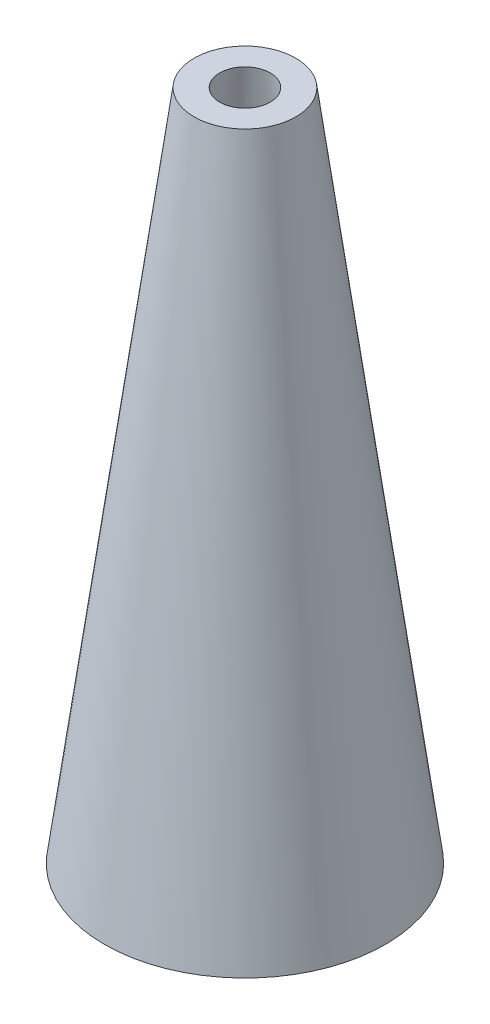
ISO-10303-21;
HEADER;
FILE_DESCRIPTION(('STEP AP214'),'2;1');
FILE_NAME('part.step','',(''),(''),'','','');
FILE_SCHEMA(('AUTOMOTIVE_DESIGN { 1 0 10303 214 1 1 1 1 }'));
ENDSEC;
DATA;
#1=APPLICATION_CONTEXT('core data for automotive mechanical design processes');
#2=APPLICATION_PROTOCOL_DEFINITION('international standard','automotive_design',2000,#1);
#3=PRODUCT_CONTEXT('',#1,'mechanical');
#4=PRODUCT('Part','Part','',(#3));
#5=PRODUCT_RELATED_PRODUCT_CATEGORY('part','',(#4));
#6=PRODUCT_DEFINITION_FORMATION('','',#4);
#7=PRODUCT_DEFINITION_CONTEXT('part definition',#1,'design');
#8=PRODUCT_DEFINITION('design','',#6,#7);
#9=PRODUCT_DEFINITION_SHAPE('','',#8);
#10=(LENGTH_UNIT() NAMED_UNIT(*) SI_UNIT(.MILLI.,.METRE.));
#11=(NAMED_UNIT(*) PLANE_ANGLE_UNIT() SI_UNIT($,.RADIAN.));
#12=(NAMED_UNIT(*) SI_UNIT($,.STERADIAN.) SOLID_ANGLE_UNIT());
#13=UNCERTAINTY_MEASURE_WITH_UNIT(LENGTH_MEASURE(1.E-05),#10,'distance_accuracy_value','');
#14=(GEOMETRIC_REPRESENTATION_CONTEXT(3) GLOBAL_UNCERTAINTY_ASSIGNED_CONTEXT((#13)) GLOBAL_UNIT_ASSIGNED_CONTEXT((#10,
#11,#12)) REPRESENTATION_CONTEXT('',''));
#15=CARTESIAN_POINT('',(0.,0.,0.));
#16=DIRECTION('',(0.,0.,1.));
#17=DIRECTION('',(1.,0.,0.));
#18=AXIS2_PLACEMENT_3D('',#15,#16,#17);
#19=CARTESIAN_POINT('',(0.,0.,0.));
#20=DIRECTION('',(0.,-1.,0.));
#21=DIRECTION('',(0.,0.,1.));
#22=AXIS2_PLACEMENT_3D('',#19,#20,#21);
#23=CONICAL_SURFACE('',#22,5.5,0.132645023151569);
#24=CARTESIAN_POINT('',(0.,26.3,0.));
#25=DIRECTION('',(0.,1.,0.));
#26=DIRECTION('',(0.,0.,1.));
#27=AXIS2_PLACEMENT_3D('',#24,#25,#26);
#28=CIRCLE('',#27,1.99083078047825);
#29=CARTESIAN_POINT('',(0.,26.3,1.99083078047825));
#30=VERTEX_POINT('',#29);
#31=EDGE_CURVE('E10',#30,#30,#28,.T.);
#32=ORIENTED_EDGE('',*,*,#31,.F.);
#33=EDGE_LOOP('',(#32));
#34=FACE_BOUND('',#33,.T.);
#35=CARTESIAN_POINT('',(0.,0.,0.));
#36=DIRECTION('',(0.,1.,0.));
#37=DIRECTION('',(0.,0.,1.));
#38=AXIS2_PLACEMENT_3D('',#35,#36,#37);
#39=CIRCLE('',#38,5.5);
#40=CARTESIAN_POINT('',(0.,0.,5.5));
#41=VERTEX_POINT('',#40);
#42=EDGE_CURVE('E44',#41,#41,#39,.T.);
#43=ORIENTED_EDGE('',*,*,#42,.T.);
#44=EDGE_LOOP('',(#43));
#45=FACE_BOUND('',#44,.T.);
#46=ADVANCED_FACE('F37',(#34,#45),#23,.T.);
#47=CARTESIAN_POINT('',(0.,26.3,0.));
#48=DIRECTION('',(0.,1.,0.));
#49=DIRECTION('',(0.,0.,1.));
#50=AXIS2_PLACEMENT_3D('',#47,#48,#49);
#51=PLANE('',#50);
#52=CARTESIAN_POINT('',(0.,26.3,0.));
#53=DIRECTION('',(0.,-1.,0.));
#54=DIRECTION('',(0.,0.,-1.));
#55=AXIS2_PLACEMENT_3D('',#52,#53,#54);
#56=CIRCLE('',#55,0.990830780478254);
#57=CARTESIAN_POINT('',(0.,26.3,-0.990830780478253));
#58=VERTEX_POINT('',#57);
#59=EDGE_CURVE('E49',#58,#58,#56,.T.);
#60=ORIENTED_EDGE('',*,*,#59,.T.);
#61=EDGE_LOOP('',(#60));
#62=FACE_BOUND('',#61,.T.);
#63=ORIENTED_EDGE('',*,*,#31,.T.);
#64=EDGE_LOOP('',(#63));
#65=FACE_BOUND('',#64,.T.);
#66=ADVANCED_FACE('F66',(#62,#65),#51,.T.);
#67=CARTESIAN_POINT('',(0.,0.,0.));
#68=DIRECTION('',(0.,1.,0.));
#69=DIRECTION('',(0.,0.,1.));
#70=AXIS2_PLACEMENT_3D('',#67,#68,#69);
#71=PLANE('',#70);
#72=CARTESIAN_POINT('',(0.,0.,0.));
#73=DIRECTION('',(0.,-1.,0.));
#74=DIRECTION('',(0.,0.,-1.));
#75=AXIS2_PLACEMENT_3D('',#72,#73,#74);
#76=CIRCLE('',#75,4.5);
#77=CARTESIAN_POINT('',(0.,0.,-4.5));
#78=VERTEX_POINT('',#77);
#79=EDGE_CURVE('E54',#78,#78,#76,.T.);
#80=ORIENTED_EDGE('',*,*,#79,.F.);
#81=EDGE_LOOP('',(#80));
#82=FACE_BOUND('',#81,.T.);
#83=ORIENTED_EDGE('',*,*,#42,.F.);
#84=EDGE_LOOP('',(#83));
#85=FACE_BOUND('',#84,.T.);
#86=ADVANCED_FACE('F63',(#82,#85),#71,.F.);
#87=CARTESIAN_POINT('',(0.,0.,0.));
#88=DIRECTION('',(0.,-1.,0.));
#89=DIRECTION('',(0.,0.,-1.));
#90=AXIS2_PLACEMENT_3D('',#87,#88,#89);
#91=CONICAL_SURFACE('',#90,4.5,0.132645023151569);
#92=CARTESIAN_POINT('',(0.,26.3,-0.990830780478253));
#93=CARTESIAN_POINT('',(0.,26.0260416666667,-1.02738462651494));
#94=CARTESIAN_POINT('',(0.,25.7520833333333,-1.06393847255162));
#95=CARTESIAN_POINT('',(0.,25.2041666666667,-1.13704616462499));
#96=CARTESIAN_POINT('',(0.,24.9302083333333,-1.17360001066168));
#97=CARTESIAN_POINT('',(0.,24.3822916666667,-1.24670770273505));
#98=CARTESIAN_POINT('',(0.,24.1083333333333,-1.28326154877173));
#99=CARTESIAN_POINT('',(0.,23.5604166666667,-1.3563692408451));
#100=CARTESIAN_POINT('',(0.,23.2864583333333,-1.39292308688179));
#101=CARTESIAN_POINT('',(0.,22.7385416666667,-1.46603077895516));
#102=CARTESIAN_POINT('',(0.,22.4645833333333,-1.50258462499184));
#103=CARTESIAN_POINT('',(0.,21.9166666666667,-1.57569231706521));
#104=CARTESIAN_POINT('',(0.,21.6427083333333,-1.6122461631019));
#105=CARTESIAN_POINT('',(0.,21.0947916666667,-1.68535385517527));
#106=CARTESIAN_POINT('',(0.,20.8208333333333,-1.72190770121195));
#107=CARTESIAN_POINT('',(0.,20.2729166666667,-1.79501539328532));
#108=CARTESIAN_POINT('',(0.,19.9989583333333,-1.831569239322));
#109=CARTESIAN_POINT('',(0.,19.4510416666667,-1.90467693139537));
#110=CARTESIAN_POINT('',(0.,19.1770833333333,-1.94123077743206));
#111=CARTESIAN_POINT('',(0.,18.6291666666667,-2.01433846950543));
#112=CARTESIAN_POINT('',(0.,18.3552083333333,-2.05089231554211));
#113=CARTESIAN_POINT('',(0.,17.8072916666667,-2.12400000761548));
#114=CARTESIAN_POINT('',(0.,17.5333333333333,-2.16055385365217));
#115=CARTESIAN_POINT('',(0.,16.9854166666667,-2.23366154572554));
#116=CARTESIAN_POINT('',(0.,16.7114583333333,-2.27021539176222));
#117=CARTESIAN_POINT('',(0.,16.1635416666667,-2.34332308383559));
#118=CARTESIAN_POINT('',(0.,15.8895833333333,-2.37987692987228));
#119=CARTESIAN_POINT('',(0.,15.3416666666667,-2.45298462194565));
#120=CARTESIAN_POINT('',(0.,15.0677083333333,-2.48953846798233));
#121=CARTESIAN_POINT('',(0.,14.5197916666667,-2.5626461600557));
#122=CARTESIAN_POINT('',(0.,14.2458333333333,-2.59920000609239));
#123=CARTESIAN_POINT('',(0.,13.6979166666667,-2.67230769816576));
#124=CARTESIAN_POINT('',(0.,13.4239583333333,-2.70886154420244));
#125=CARTESIAN_POINT('',(0.,12.8760416666667,-2.78196923627581));
#126=CARTESIAN_POINT('',(0.,12.6020833333333,-2.8185230823125));
#127=CARTESIAN_POINT('',(0.,12.0541666666667,-2.89163077438587));
#128=CARTESIAN_POINT('',(0.,11.7802083333333,-2.92818462042255));
#129=CARTESIAN_POINT('',(0.,11.2322916666667,-3.00129231249592));
#130=CARTESIAN_POINT('',(0.,10.9583333333333,-3.03784615853261));
#131=CARTESIAN_POINT('',(0.,10.4104166666667,-3.11095385060597));
#132=CARTESIAN_POINT('',(0.,10.1364583333333,-3.14750769664266));
#133=CARTESIAN_POINT('',(0.,9.58854166666667,-3.22061538871603));
#134=CARTESIAN_POINT('',(0.,9.31458333333333,-3.25716923475271));
#135=CARTESIAN_POINT('',(0.,8.76666666666667,-3.33027692682608));
#136=CARTESIAN_POINT('',(0.,8.49270833333333,-3.36683077286277));
#137=CARTESIAN_POINT('',(0.,7.94479166666667,-3.43993846493614));
#138=CARTESIAN_POINT('',(0.,7.67083333333333,-3.47649231097282));
#139=CARTESIAN_POINT('',(0.,7.12291666666667,-3.54960000304619));
#140=CARTESIAN_POINT('',(0.,6.84895833333333,-3.58615384908288));
#141=CARTESIAN_POINT('',(0.,6.30104166666667,-3.65926154115625));
#142=CARTESIAN_POINT('',(0.,6.02708333333333,-3.69581538719293));
#143=CARTESIAN_POINT('',(0.,5.47916666666667,-3.7689230792663));
#144=CARTESIAN_POINT('',(0.,5.20520833333333,-3.80547692530299));
#145=CARTESIAN_POINT('',(0.,4.65729166666667,-3.87858461737636));
#146=CARTESIAN_POINT('',(0.,4.38333333333334,-3.91513846341304));
#147=CARTESIAN_POINT('',(0.,3.83541666666667,-3.98824615548641));
#148=CARTESIAN_POINT('',(0.,3.56145833333333,-4.0248000015231));
#149=CARTESIAN_POINT('',(0.,3.01354166666667,-4.09790769359647));
#150=CARTESIAN_POINT('',(0.,2.73958333333333,-4.13446153963315));
#151=CARTESIAN_POINT('',(0.,2.19166666666667,-4.20756923170652));
#152=CARTESIAN_POINT('',(0.,1.91770833333333,-4.24412307774321));
#153=CARTESIAN_POINT('',(0.,1.36979166666667,-4.31723076981658));
#154=CARTESIAN_POINT('',(0.,1.09583333333333,-4.35378461585326));
#155=CARTESIAN_POINT('',(0.,0.547916666666667,-4.42689230792663));
#156=CARTESIAN_POINT('',(0.,0.273958333333333,-4.46344615396331));
#157=CARTESIAN_POINT('',(0.,0.,-4.5));
#158=B_SPLINE_CURVE_WITH_KNOTS('',3,(#92,#93,#94,#95,#96,#97,#98,#99,#100,#101,#102,#103,#104,
#105,#106,#107,#108,#109,#110,#111,#112,#113,#114,#115,#116,#117,#118,#119,#120,#121,#122,#123,
#124,#125,#126,#127,#128,#129,#130,#131,#132,#133,#134,#135,#136,#137,#138,#139,#140,#141,#142,
#143,#144,#145,#146,#147,#148,#149,#150,#151,#152,#153,#154,#155,#156,#157),.UNSPECIFIED.,.F.,
.F.,(4,2,2,2,2,2,2,2,2,2,2,2,2,2,2,2,2,2,2,2,2,2,2,2,2,2,2,2,2,2,2,2,4),(0.,0.829158711324715,
1.65831742264943,2.48747613397415,3.31663484529886,4.14579355662358,4.97495226794829,
5.80411097927301,6.63326969059773,7.46242840192244,8.29158711324716,9.12074582457188,
9.94990453589659,10.7790632472213,11.608221958546,12.4373806698707,13.2665393811955,
14.0956980925202,14.9248568038449,15.7540155151696,16.5831742264943,17.412332937819,
18.2414916491437,19.0706503604685,19.8998090717932,20.7289677831179,21.5581264944426,
22.3872852057673,23.216443917092,24.0456026284167,24.8747613397415,25.7039200510662,
26.5330787623909),.UNSPECIFIED.);
#159=EDGE_CURVE('BSEAM61',#58,#78,#158,.T.);
#160=ORIENTED_EDGE('',*,*,#59,.F.);
#161=ORIENTED_EDGE('',*,*,#79,.T.);
#162=ORIENTED_EDGE('',*,*,#159,.T.);
#163=ORIENTED_EDGE('',*,*,#159,.F.);
#164=EDGE_LOOP('',(#160,#162,#161,#163));
#165=FACE_BOUND('',#164,.T.);
#166=ADVANCED_FACE('F61',(#165),#91,.F.);
#167=CLOSED_SHELL('',(#46,#66,#86,#166));
#168=MANIFOLD_SOLID_BREP('B2',#167);
#169=ADVANCED_BREP_SHAPE_REPRESENTATION('',(#18,#168),#14);
#170=SHAPE_DEFINITION_REPRESENTATION(#9,#169);
ENDSEC;
END-ISO-10303-21;
